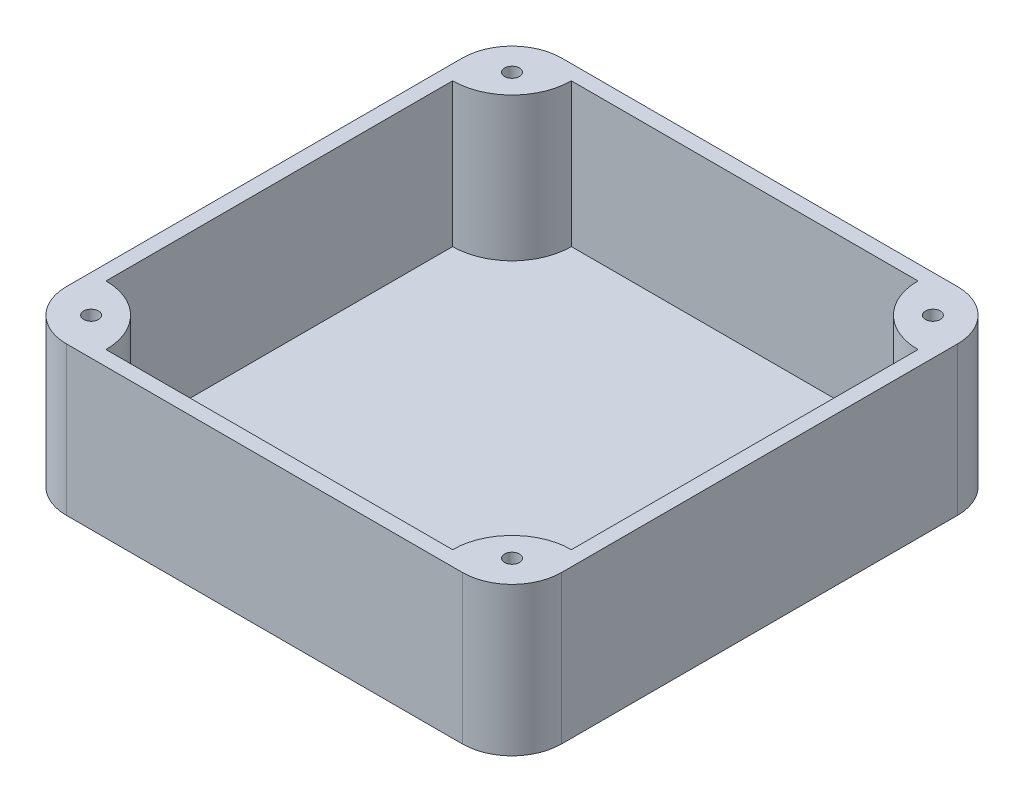
ISO-10303-21;
HEADER;
FILE_DESCRIPTION(('STEP AP214'),'2;1');
FILE_NAME('part.step','',(''),(''),'','','');
FILE_SCHEMA(('AUTOMOTIVE_DESIGN { 1 0 10303 214 1 1 1 1 }'));
ENDSEC;
DATA;
#1=APPLICATION_CONTEXT('core data for automotive mechanical design processes');
#2=APPLICATION_PROTOCOL_DEFINITION('international standard','automotive_design',2000,#1);
#3=PRODUCT_CONTEXT('',#1,'mechanical');
#4=PRODUCT('Part','Part','',(#3));
#5=PRODUCT_RELATED_PRODUCT_CATEGORY('part','',(#4));
#6=PRODUCT_DEFINITION_FORMATION('','',#4);
#7=PRODUCT_DEFINITION_CONTEXT('part definition',#1,'design');
#8=PRODUCT_DEFINITION('design','',#6,#7);
#9=PRODUCT_DEFINITION_SHAPE('','',#8);
#10=(LENGTH_UNIT() NAMED_UNIT(*) SI_UNIT(.MILLI.,.METRE.));
#11=(NAMED_UNIT(*) PLANE_ANGLE_UNIT() SI_UNIT($,.RADIAN.));
#12=(NAMED_UNIT(*) SI_UNIT($,.STERADIAN.) SOLID_ANGLE_UNIT());
#13=UNCERTAINTY_MEASURE_WITH_UNIT(LENGTH_MEASURE(1.E-05),#10,'distance_accuracy_value','');
#14=(GEOMETRIC_REPRESENTATION_CONTEXT(3) GLOBAL_UNCERTAINTY_ASSIGNED_CONTEXT((#13)) GLOBAL_UNIT_ASSIGNED_CONTEXT((#10,
#11,#12)) REPRESENTATION_CONTEXT('',''));
#15=CARTESIAN_POINT('',(0.,0.,0.));
#16=DIRECTION('',(0.,0.,1.));
#17=DIRECTION('',(1.,0.,0.));
#18=AXIS2_PLACEMENT_3D('',#15,#16,#17);
#19=CARTESIAN_POINT('',(0.,30.,-50.));
#20=DIRECTION('',(0.,0.,-1.));
#21=DIRECTION('',(-1.,0.,0.));
#22=AXIS2_PLACEMENT_3D('',#19,#20,#21);
#23=PLANE('',#22);
#24=DIRECTION('',(1.,0.,0.));
#25=VECTOR('',#24,1.);
#26=CARTESIAN_POINT('',(0.,30.,-50.));
#27=LINE('',#26,#25);
#28=CARTESIAN_POINT('',(-40.,30.,-50.));
#29=VERTEX_POINT('',#28);
#30=CARTESIAN_POINT('',(40.,30.,-50.));
#31=VERTEX_POINT('',#30);
#32=EDGE_CURVE('E288',#29,#31,#27,.T.);
#33=ORIENTED_EDGE('',*,*,#32,.T.);
#34=DIRECTION('',(0.,-1.,0.));
#35=VECTOR('',#34,1.);
#36=CARTESIAN_POINT('',(40.,0.,-50.));
#37=LINE('',#36,#35);
#38=CARTESIAN_POINT('',(40.,0.,-50.));
#39=VERTEX_POINT('',#38);
#40=EDGE_CURVE('E211',#31,#39,#37,.T.);
#41=ORIENTED_EDGE('',*,*,#40,.T.);
#42=DIRECTION('',(1.,0.,0.));
#43=VECTOR('',#42,1.);
#44=CARTESIAN_POINT('',(0.,0.,-50.));
#45=LINE('',#44,#43);
#46=CARTESIAN_POINT('',(-40.,0.,-50.));
#47=VERTEX_POINT('',#46);
#48=EDGE_CURVE('E249',#47,#39,#45,.T.);
#49=ORIENTED_EDGE('',*,*,#48,.F.);
#50=DIRECTION('',(0.,-1.,0.));
#51=VECTOR('',#50,1.);
#52=CARTESIAN_POINT('',(-40.,30.,-50.));
#53=LINE('',#52,#51);
#54=EDGE_CURVE('E209',#47,#29,#53,.F.);
#55=ORIENTED_EDGE('',*,*,#54,.T.);
#56=EDGE_LOOP('',(#33,#41,#49,#55));
#57=FACE_BOUND('',#56,.T.);
#58=ADVANCED_FACE('F39',(#57),#23,.T.);
#59=CARTESIAN_POINT('',(-50.,30.,0.));
#60=DIRECTION('',(1.,0.,0.));
#61=DIRECTION('',(0.,0.,-1.));
#62=AXIS2_PLACEMENT_3D('',#59,#60,#61);
#63=PLANE('',#62);
#64=DIRECTION('',(0.,0.,1.));
#65=VECTOR('',#64,1.);
#66=CARTESIAN_POINT('',(-50.,30.,0.));
#67=LINE('',#66,#65);
#68=CARTESIAN_POINT('',(-50.,30.,-40.));
#69=VERTEX_POINT('',#68);
#70=CARTESIAN_POINT('',(-50.,30.,40.));
#71=VERTEX_POINT('',#70);
#72=EDGE_CURVE('E286',#69,#71,#67,.T.);
#73=ORIENTED_EDGE('',*,*,#72,.F.);
#74=DIRECTION('',(0.,-1.,0.));
#75=VECTOR('',#74,1.);
#76=CARTESIAN_POINT('',(-50.,0.,-40.));
#77=LINE('',#76,#75);
#78=CARTESIAN_POINT('',(-50.,0.,-40.));
#79=VERTEX_POINT('',#78);
#80=EDGE_CURVE('E215',#69,#79,#77,.T.);
#81=ORIENTED_EDGE('',*,*,#80,.T.);
#82=DIRECTION('',(0.,0.,1.));
#83=VECTOR('',#82,1.);
#84=CARTESIAN_POINT('',(-50.,0.,0.));
#85=LINE('',#84,#83);
#86=CARTESIAN_POINT('',(-50.,0.,40.));
#87=VERTEX_POINT('',#86);
#88=EDGE_CURVE('E271',#79,#87,#85,.T.);
#89=ORIENTED_EDGE('',*,*,#88,.T.);
#90=DIRECTION('',(0.,-1.,0.));
#91=VECTOR('',#90,1.);
#92=CARTESIAN_POINT('',(-50.,30.,40.));
#93=LINE('',#92,#91);
#94=EDGE_CURVE('E54',#87,#71,#93,.F.);
#95=ORIENTED_EDGE('',*,*,#94,.T.);
#96=EDGE_LOOP('',(#73,#81,#89,#95));
#97=FACE_BOUND('',#96,.T.);
#98=ADVANCED_FACE('F331',(#97),#63,.F.);
#99=CARTESIAN_POINT('',(0.,30.,50.));
#100=DIRECTION('',(0.,0.,-1.));
#101=DIRECTION('',(-1.,0.,0.));
#102=AXIS2_PLACEMENT_3D('',#99,#100,#101);
#103=PLANE('',#102);
#104=DIRECTION('',(1.,0.,0.));
#105=VECTOR('',#104,1.);
#106=CARTESIAN_POINT('',(0.,0.,50.));
#107=LINE('',#106,#105);
#108=CARTESIAN_POINT('',(-40.,0.,50.));
#109=VERTEX_POINT('',#108);
#110=CARTESIAN_POINT('',(40.,0.,50.));
#111=VERTEX_POINT('',#110);
#112=EDGE_CURVE('E268',#109,#111,#107,.T.);
#113=ORIENTED_EDGE('',*,*,#112,.T.);
#114=DIRECTION('',(0.,-1.,0.));
#115=VECTOR('',#114,1.);
#116=CARTESIAN_POINT('',(40.,30.,50.));
#117=LINE('',#116,#115);
#118=CARTESIAN_POINT('',(40.,30.,50.));
#119=VERTEX_POINT('',#118);
#120=EDGE_CURVE('E200',#111,#119,#117,.F.);
#121=ORIENTED_EDGE('',*,*,#120,.T.);
#122=DIRECTION('',(1.,0.,0.));
#123=VECTOR('',#122,1.);
#124=CARTESIAN_POINT('',(0.,30.,50.));
#125=LINE('',#124,#123);
#126=CARTESIAN_POINT('',(-40.,30.,50.));
#127=VERTEX_POINT('',#126);
#128=EDGE_CURVE('E283',#127,#119,#125,.T.);
#129=ORIENTED_EDGE('',*,*,#128,.F.);
#130=DIRECTION('',(0.,-1.,0.));
#131=VECTOR('',#130,1.);
#132=CARTESIAN_POINT('',(-40.,30.,50.));
#133=LINE('',#132,#131);
#134=EDGE_CURVE('E197',#127,#109,#133,.T.);
#135=ORIENTED_EDGE('',*,*,#134,.T.);
#136=EDGE_LOOP('',(#113,#121,#129,#135));
#137=FACE_BOUND('',#136,.T.);
#138=ADVANCED_FACE('F337',(#137),#103,.F.);
#139=CARTESIAN_POINT('',(-47.,30.,0.));
#140=DIRECTION('',(-1.,0.,0.));
#141=DIRECTION('',(0.,0.,1.));
#142=AXIS2_PLACEMENT_3D('',#139,#140,#141);
#143=PLANE('',#142);
#144=DIRECTION('',(0.,-1.,0.));
#145=VECTOR('',#144,1.);
#146=CARTESIAN_POINT('',(-47.,30.,35.));
#147=LINE('',#146,#145);
#148=CARTESIAN_POINT('',(-47.,30.,35.));
#149=VERTEX_POINT('',#148);
#150=CARTESIAN_POINT('',(-47.,1.,35.));
#151=VERTEX_POINT('',#150);
#152=EDGE_CURVE('E158',#149,#151,#147,.T.);
#153=ORIENTED_EDGE('',*,*,#152,.T.);
#154=DIRECTION('',(0.,0.,-1.));
#155=VECTOR('',#154,1.);
#156=CARTESIAN_POINT('',(-47.,1.,0.));
#157=LINE('',#156,#155);
#158=CARTESIAN_POINT('',(-47.,1.,-35.));
#159=VERTEX_POINT('',#158);
#160=EDGE_CURVE('E166',#151,#159,#157,.T.);
#161=ORIENTED_EDGE('',*,*,#160,.T.);
#162=DIRECTION('',(0.,-1.,0.));
#163=VECTOR('',#162,1.);
#164=CARTESIAN_POINT('',(-47.,30.,-35.));
#165=LINE('',#164,#163);
#166=CARTESIAN_POINT('',(-47.,30.,-35.));
#167=VERTEX_POINT('',#166);
#168=EDGE_CURVE('E179',#167,#159,#165,.T.);
#169=ORIENTED_EDGE('',*,*,#168,.F.);
#170=DIRECTION('',(0.,0.,-1.));
#171=VECTOR('',#170,1.);
#172=CARTESIAN_POINT('',(-47.,30.,0.));
#173=LINE('',#172,#171);
#174=EDGE_CURVE('E177',#149,#167,#173,.T.);
#175=ORIENTED_EDGE('',*,*,#174,.F.);
#176=EDGE_LOOP('',(#153,#161,#169,#175));
#177=FACE_BOUND('',#176,.T.);
#178=ADVANCED_FACE('F176',(#177),#143,.F.);
#179=CARTESIAN_POINT('',(0.,30.,-47.));
#180=DIRECTION('',(0.,0.,-1.));
#181=DIRECTION('',(-1.,0.,0.));
#182=AXIS2_PLACEMENT_3D('',#179,#180,#181);
#183=PLANE('',#182);
#184=DIRECTION('',(0.,-1.,0.));
#185=VECTOR('',#184,1.);
#186=CARTESIAN_POINT('',(-35.,30.,-47.));
#187=LINE('',#186,#185);
#188=CARTESIAN_POINT('',(-35.,30.,-47.));
#189=VERTEX_POINT('',#188);
#190=CARTESIAN_POINT('',(-35.,1.,-47.));
#191=VERTEX_POINT('',#190);
#192=EDGE_CURVE('E183',#189,#191,#187,.T.);
#193=ORIENTED_EDGE('',*,*,#192,.T.);
#194=DIRECTION('',(1.,0.,0.));
#195=VECTOR('',#194,1.);
#196=CARTESIAN_POINT('',(0.,1.,-47.));
#197=LINE('',#196,#195);
#198=CARTESIAN_POINT('',(35.,1.,-47.));
#199=VERTEX_POINT('',#198);
#200=EDGE_CURVE('E234',#191,#199,#197,.T.);
#201=ORIENTED_EDGE('',*,*,#200,.T.);
#202=DIRECTION('',(0.,-1.,0.));
#203=VECTOR('',#202,1.);
#204=CARTESIAN_POINT('',(35.,30.,-47.));
#205=LINE('',#204,#203);
#206=CARTESIAN_POINT('',(35.,30.,-47.));
#207=VERTEX_POINT('',#206);
#208=EDGE_CURVE('E246',#207,#199,#205,.T.);
#209=ORIENTED_EDGE('',*,*,#208,.F.);
#210=DIRECTION('',(1.,0.,0.));
#211=VECTOR('',#210,1.);
#212=CARTESIAN_POINT('',(0.,30.,-47.));
#213=LINE('',#212,#211);
#214=EDGE_CURVE('E297',#189,#207,#213,.T.);
#215=ORIENTED_EDGE('',*,*,#214,.F.);
#216=EDGE_LOOP('',(#193,#201,#209,#215));
#217=FACE_BOUND('',#216,.T.);
#218=ADVANCED_FACE('F244',(#217),#183,.F.);
#219=CARTESIAN_POINT('',(47.,30.,0.));
#220=DIRECTION('',(-1.,0.,0.));
#221=DIRECTION('',(0.,0.,1.));
#222=AXIS2_PLACEMENT_3D('',#219,#220,#221);
#223=PLANE('',#222);
#224=DIRECTION('',(0.,0.,-1.));
#225=VECTOR('',#224,1.);
#226=CARTESIAN_POINT('',(47.,1.,0.));
#227=LINE('',#226,#225);
#228=CARTESIAN_POINT('',(47.,1.,35.));
#229=VERTEX_POINT('',#228);
#230=CARTESIAN_POINT('',(47.,1.,-35.));
#231=VERTEX_POINT('',#230);
#232=EDGE_CURVE('E237',#229,#231,#227,.T.);
#233=ORIENTED_EDGE('',*,*,#232,.F.);
#234=DIRECTION('',(0.,-1.,0.));
#235=VECTOR('',#234,1.);
#236=CARTESIAN_POINT('',(47.,30.,35.));
#237=LINE('',#236,#235);
#238=CARTESIAN_POINT('',(47.,30.,35.));
#239=VERTEX_POINT('',#238);
#240=EDGE_CURVE('E254',#239,#229,#237,.T.);
#241=ORIENTED_EDGE('',*,*,#240,.F.);
#242=DIRECTION('',(0.,0.,-1.));
#243=VECTOR('',#242,1.);
#244=CARTESIAN_POINT('',(47.,30.,0.));
#245=LINE('',#244,#243);
#246=CARTESIAN_POINT('',(47.,30.,-35.));
#247=VERTEX_POINT('',#246);
#248=EDGE_CURVE('E294',#239,#247,#245,.T.);
#249=ORIENTED_EDGE('',*,*,#248,.T.);
#250=DIRECTION('',(0.,-1.,0.));
#251=VECTOR('',#250,1.);
#252=CARTESIAN_POINT('',(47.,30.,-35.));
#253=LINE('',#252,#251);
#254=EDGE_CURVE('E252',#247,#231,#253,.T.);
#255=ORIENTED_EDGE('',*,*,#254,.T.);
#256=EDGE_LOOP('',(#233,#241,#249,#255));
#257=FACE_BOUND('',#256,.T.);
#258=ADVANCED_FACE('F345',(#257),#223,.T.);
#259=CARTESIAN_POINT('',(0.,30.,47.));
#260=DIRECTION('',(0.,0.,-1.));
#261=DIRECTION('',(-1.,0.,0.));
#262=AXIS2_PLACEMENT_3D('',#259,#260,#261);
#263=PLANE('',#262);
#264=DIRECTION('',(1.,0.,0.));
#265=VECTOR('',#264,1.);
#266=CARTESIAN_POINT('',(0.,1.,47.));
#267=LINE('',#266,#265);
#268=CARTESIAN_POINT('',(-35.,1.,47.));
#269=VERTEX_POINT('',#268);
#270=CARTESIAN_POINT('',(35.,1.,47.));
#271=VERTEX_POINT('',#270);
#272=EDGE_CURVE('E172',#269,#271,#267,.T.);
#273=ORIENTED_EDGE('',*,*,#272,.F.);
#274=DIRECTION('',(0.,-1.,0.));
#275=VECTOR('',#274,1.);
#276=CARTESIAN_POINT('',(-35.,30.,47.));
#277=LINE('',#276,#275);
#278=CARTESIAN_POINT('',(-35.,30.,47.));
#279=VERTEX_POINT('',#278);
#280=EDGE_CURVE('E159',#279,#269,#277,.T.);
#281=ORIENTED_EDGE('',*,*,#280,.F.);
#282=DIRECTION('',(1.,0.,0.));
#283=VECTOR('',#282,1.);
#284=CARTESIAN_POINT('',(0.,30.,47.));
#285=LINE('',#284,#283);
#286=CARTESIAN_POINT('',(35.,30.,47.));
#287=VERTEX_POINT('',#286);
#288=EDGE_CURVE('E291',#279,#287,#285,.T.);
#289=ORIENTED_EDGE('',*,*,#288,.T.);
#290=DIRECTION('',(0.,-1.,0.));
#291=VECTOR('',#290,1.);
#292=CARTESIAN_POINT('',(35.,30.,47.));
#293=LINE('',#292,#291);
#294=EDGE_CURVE('E259',#287,#271,#293,.T.);
#295=ORIENTED_EDGE('',*,*,#294,.T.);
#296=EDGE_LOOP('',(#273,#281,#289,#295));
#297=FACE_BOUND('',#296,.T.);
#298=ADVANCED_FACE('F341',(#297),#263,.T.);
#299=CARTESIAN_POINT('',(42.5,30.,42.5));
#300=DIRECTION('',(0.,-1.,0.));
#301=DIRECTION('',(0.,0.,-1.));
#302=AXIS2_PLACEMENT_3D('',#299,#300,#301);
#303=CYLINDRICAL_SURFACE('',#302,1.5);
#304=CARTESIAN_POINT('',(42.5,1.,42.5));
#305=DIRECTION('',(0.,1.,0.));
#306=DIRECTION('',(0.,0.,1.));
#307=AXIS2_PLACEMENT_3D('',#304,#305,#306);
#308=CIRCLE('',#307,1.5);
#309=CARTESIAN_POINT('',(42.5,1.,44.));
#310=VERTEX_POINT('',#309);
#311=EDGE_CURVE('E221',#310,#310,#308,.T.);
#312=ORIENTED_EDGE('',*,*,#311,.F.);
#313=EDGE_LOOP('',(#312));
#314=FACE_BOUND('',#313,.T.);
#315=CARTESIAN_POINT('',(42.5,30.,42.5));
#316=DIRECTION('',(0.,1.,0.));
#317=DIRECTION('',(0.,0.,1.));
#318=AXIS2_PLACEMENT_3D('',#315,#316,#317);
#319=CIRCLE('',#318,1.5);
#320=CARTESIAN_POINT('',(42.5,30.,44.));
#321=VERTEX_POINT('',#320);
#322=EDGE_CURVE('E277',#321,#321,#319,.T.);
#323=ORIENTED_EDGE('',*,*,#322,.T.);
#324=EDGE_LOOP('',(#323));
#325=FACE_BOUND('',#324,.T.);
#326=ADVANCED_FACE('F344',(#314,#325),#303,.F.);
#327=CARTESIAN_POINT('',(50.,30.,0.));
#328=DIRECTION('',(-1.,0.,0.));
#329=DIRECTION('',(0.,0.,1.));
#330=AXIS2_PLACEMENT_3D('',#327,#328,#329);
#331=PLANE('',#330);
#332=DIRECTION('',(0.,0.,-1.));
#333=VECTOR('',#332,1.);
#334=CARTESIAN_POINT('',(50.,30.,0.));
#335=LINE('',#334,#333);
#336=CARTESIAN_POINT('',(50.,30.,40.));
#337=VERTEX_POINT('',#336);
#338=CARTESIAN_POINT('',(50.,30.,-40.));
#339=VERTEX_POINT('',#338);
#340=EDGE_CURVE('E280',#337,#339,#335,.T.);
#341=ORIENTED_EDGE('',*,*,#340,.F.);
#342=DIRECTION('',(0.,-1.,0.));
#343=VECTOR('',#342,1.);
#344=CARTESIAN_POINT('',(50.,30.,40.));
#345=LINE('',#344,#343);
#346=CARTESIAN_POINT('',(50.,0.,40.));
#347=VERTEX_POINT('',#346);
#348=EDGE_CURVE('E181',#337,#347,#345,.T.);
#349=ORIENTED_EDGE('',*,*,#348,.T.);
#350=DIRECTION('',(0.,0.,-1.));
#351=VECTOR('',#350,1.);
#352=CARTESIAN_POINT('',(50.,0.,0.));
#353=LINE('',#352,#351);
#354=CARTESIAN_POINT('',(50.,0.,-40.));
#355=VERTEX_POINT('',#354);
#356=EDGE_CURVE('E264',#347,#355,#353,.T.);
#357=ORIENTED_EDGE('',*,*,#356,.T.);
#358=DIRECTION('',(0.,-1.,0.));
#359=VECTOR('',#358,1.);
#360=CARTESIAN_POINT('',(50.,30.,-40.));
#361=LINE('',#360,#359);
#362=EDGE_CURVE('E178',#355,#339,#361,.F.);
#363=ORIENTED_EDGE('',*,*,#362,.T.);
#364=EDGE_LOOP('',(#341,#349,#357,#363));
#365=FACE_BOUND('',#364,.T.);
#366=ADVANCED_FACE('F357',(#365),#331,.F.);
#367=CARTESIAN_POINT('',(-42.5,30.,-42.5));
#368=DIRECTION('',(0.,-1.,0.));
#369=DIRECTION('',(0.,0.,-1.));
#370=AXIS2_PLACEMENT_3D('',#367,#368,#369);
#371=CYLINDRICAL_SURFACE('',#370,1.5);
#372=CARTESIAN_POINT('',(-42.5,1.,-42.5));
#373=DIRECTION('',(0.,1.,0.));
#374=DIRECTION('',(0.,0.,1.));
#375=AXIS2_PLACEMENT_3D('',#372,#373,#374);
#376=CIRCLE('',#375,1.5);
#377=CARTESIAN_POINT('',(-42.5,1.,-41.));
#378=VERTEX_POINT('',#377);
#379=EDGE_CURVE('E218',#378,#378,#376,.T.);
#380=ORIENTED_EDGE('',*,*,#379,.F.);
#381=EDGE_LOOP('',(#380));
#382=FACE_BOUND('',#381,.T.);
#383=CARTESIAN_POINT('',(-42.5,30.,-42.5));
#384=DIRECTION('',(0.,1.,0.));
#385=DIRECTION('',(0.,0.,1.));
#386=AXIS2_PLACEMENT_3D('',#383,#384,#385);
#387=CIRCLE('',#386,1.5);
#388=CARTESIAN_POINT('',(-42.5,30.,-41.));
#389=VERTEX_POINT('',#388);
#390=EDGE_CURVE('E300',#389,#389,#387,.T.);
#391=ORIENTED_EDGE('',*,*,#390,.T.);
#392=EDGE_LOOP('',(#391));
#393=FACE_BOUND('',#392,.T.);
#394=ADVANCED_FACE('F354',(#382,#393),#371,.F.);
#395=CARTESIAN_POINT('',(42.5,30.,-42.5));
#396=DIRECTION('',(0.,-1.,0.));
#397=DIRECTION('',(0.,0.,-1.));
#398=AXIS2_PLACEMENT_3D('',#395,#396,#397);
#399=CYLINDRICAL_SURFACE('',#398,1.5);
#400=CARTESIAN_POINT('',(42.5,1.,-42.5));
#401=DIRECTION('',(0.,1.,0.));
#402=DIRECTION('',(0.,0.,1.));
#403=AXIS2_PLACEMENT_3D('',#400,#401,#402);
#404=CIRCLE('',#403,1.5);
#405=CARTESIAN_POINT('',(42.5,1.,-41.));
#406=VERTEX_POINT('',#405);
#407=EDGE_CURVE('E309',#406,#406,#404,.F.);
#408=ORIENTED_EDGE('',*,*,#407,.T.);
#409=EDGE_LOOP('',(#408));
#410=FACE_BOUND('',#409,.T.);
#411=CARTESIAN_POINT('',(42.5,30.,-42.5));
#412=DIRECTION('',(0.,1.,0.));
#413=DIRECTION('',(0.,0.,1.));
#414=AXIS2_PLACEMENT_3D('',#411,#412,#413);
#415=CIRCLE('',#414,1.5);
#416=CARTESIAN_POINT('',(42.5,30.,-41.));
#417=VERTEX_POINT('',#416);
#418=EDGE_CURVE('E267',#417,#417,#415,.F.);
#419=ORIENTED_EDGE('',*,*,#418,.F.);
#420=EDGE_LOOP('',(#419));
#421=FACE_BOUND('',#420,.T.);
#422=ADVANCED_FACE('F313',(#410,#421),#399,.F.);
#423=CARTESIAN_POINT('',(-42.5,30.,42.5));
#424=DIRECTION('',(0.,-1.,0.));
#425=DIRECTION('',(0.,0.,-1.));
#426=AXIS2_PLACEMENT_3D('',#423,#424,#425);
#427=CYLINDRICAL_SURFACE('',#426,1.5);
#428=CARTESIAN_POINT('',(-42.5,1.,42.5));
#429=DIRECTION('',(0.,1.,0.));
#430=DIRECTION('',(0.,0.,1.));
#431=AXIS2_PLACEMENT_3D('',#428,#429,#430);
#432=CIRCLE('',#431,1.5);
#433=CARTESIAN_POINT('',(-42.5,1.,44.));
#434=VERTEX_POINT('',#433);
#435=EDGE_CURVE('E173',#434,#434,#432,.F.);
#436=ORIENTED_EDGE('',*,*,#435,.T.);
#437=EDGE_LOOP('',(#436));
#438=FACE_BOUND('',#437,.T.);
#439=CARTESIAN_POINT('',(-42.5,30.,42.5));
#440=DIRECTION('',(0.,1.,0.));
#441=DIRECTION('',(0.,0.,1.));
#442=AXIS2_PLACEMENT_3D('',#439,#440,#441);
#443=CIRCLE('',#442,1.5);
#444=CARTESIAN_POINT('',(-42.5,30.,44.));
#445=VERTEX_POINT('',#444);
#446=EDGE_CURVE('E263',#445,#445,#443,.F.);
#447=ORIENTED_EDGE('',*,*,#446,.F.);
#448=EDGE_LOOP('',(#447));
#449=FACE_BOUND('',#448,.T.);
#450=ADVANCED_FACE('F361',(#438,#449),#427,.F.);
#451=CARTESIAN_POINT('',(0.,30.,0.));
#452=DIRECTION('',(0.,1.,0.));
#453=DIRECTION('',(0.,0.,1.));
#454=AXIS2_PLACEMENT_3D('',#451,#452,#453);
#455=PLANE('',#454);
#456=ORIENTED_EDGE('',*,*,#418,.T.);
#457=EDGE_LOOP('',(#456));
#458=FACE_BOUND('',#457,.T.);
#459=ORIENTED_EDGE('',*,*,#390,.F.);
#460=EDGE_LOOP('',(#459));
#461=FACE_BOUND('',#460,.T.);
#462=ORIENTED_EDGE('',*,*,#248,.F.);
#463=CARTESIAN_POINT('',(47.,30.,47.));
#464=DIRECTION('',(0.,1.,0.));
#465=DIRECTION('',(0.,0.,1.));
#466=AXIS2_PLACEMENT_3D('',#463,#464,#465);
#467=CIRCLE('',#466,12.);
#468=EDGE_CURVE('E230',#239,#287,#467,.T.);
#469=ORIENTED_EDGE('',*,*,#468,.T.);
#470=ORIENTED_EDGE('',*,*,#288,.F.);
#471=CARTESIAN_POINT('',(-47.,30.,47.));
#472=DIRECTION('',(0.,1.,0.));
#473=DIRECTION('',(0.,0.,1.));
#474=AXIS2_PLACEMENT_3D('',#471,#472,#473);
#475=CIRCLE('',#474,12.);
#476=EDGE_CURVE('E228',#279,#149,#475,.T.);
#477=ORIENTED_EDGE('',*,*,#476,.T.);
#478=ORIENTED_EDGE('',*,*,#174,.T.);
#479=CARTESIAN_POINT('',(-47.,30.,-47.));
#480=DIRECTION('',(0.,1.,0.));
#481=DIRECTION('',(0.,0.,1.));
#482=AXIS2_PLACEMENT_3D('',#479,#480,#481);
#483=CIRCLE('',#482,12.);
#484=EDGE_CURVE('E224',#167,#189,#483,.T.);
#485=ORIENTED_EDGE('',*,*,#484,.T.);
#486=ORIENTED_EDGE('',*,*,#214,.T.);
#487=CARTESIAN_POINT('',(47.,30.,-47.));
#488=DIRECTION('',(0.,1.,0.));
#489=DIRECTION('',(0.,0.,1.));
#490=AXIS2_PLACEMENT_3D('',#487,#488,#489);
#491=CIRCLE('',#490,12.);
#492=EDGE_CURVE('E226',#207,#247,#491,.T.);
#493=ORIENTED_EDGE('',*,*,#492,.T.);
#494=EDGE_LOOP('',(#462,#469,#470,#477,#478,#485,#486,#493));
#495=FACE_BOUND('',#494,.T.);
#496=ORIENTED_EDGE('',*,*,#128,.T.);
#497=CARTESIAN_POINT('',(40.,30.,40.));
#498=DIRECTION('',(0.,1.,0.));
#499=DIRECTION('',(0.,0.,1.));
#500=AXIS2_PLACEMENT_3D('',#497,#498,#499);
#501=CIRCLE('',#500,10.);
#502=EDGE_CURVE('E207',#119,#337,#501,.T.);
#503=ORIENTED_EDGE('',*,*,#502,.T.);
#504=ORIENTED_EDGE('',*,*,#340,.T.);
#505=CARTESIAN_POINT('',(40.,30.,-40.));
#506=DIRECTION('',(0.,1.,0.));
#507=DIRECTION('',(0.,0.,1.));
#508=AXIS2_PLACEMENT_3D('',#505,#506,#507);
#509=CIRCLE('',#508,10.);
#510=EDGE_CURVE('E205',#339,#31,#509,.T.);
#511=ORIENTED_EDGE('',*,*,#510,.T.);
#512=ORIENTED_EDGE('',*,*,#32,.F.);
#513=CARTESIAN_POINT('',(-40.,30.,-40.));
#514=DIRECTION('',(0.,1.,0.));
#515=DIRECTION('',(0.,0.,1.));
#516=AXIS2_PLACEMENT_3D('',#513,#514,#515);
#517=CIRCLE('',#516,10.);
#518=EDGE_CURVE('E61',#29,#69,#517,.T.);
#519=ORIENTED_EDGE('',*,*,#518,.T.);
#520=ORIENTED_EDGE('',*,*,#72,.T.);
#521=CARTESIAN_POINT('',(-40.,30.,40.));
#522=DIRECTION('',(0.,1.,0.));
#523=DIRECTION('',(0.,0.,1.));
#524=AXIS2_PLACEMENT_3D('',#521,#522,#523);
#525=CIRCLE('',#524,10.);
#526=EDGE_CURVE('E202',#71,#127,#525,.T.);
#527=ORIENTED_EDGE('',*,*,#526,.T.);
#528=EDGE_LOOP('',(#496,#503,#504,#511,#512,#519,#520,#527));
#529=FACE_BOUND('',#528,.T.);
#530=ORIENTED_EDGE('',*,*,#322,.F.);
#531=EDGE_LOOP('',(#530));
#532=FACE_BOUND('',#531,.T.);
#533=ORIENTED_EDGE('',*,*,#446,.T.);
#534=EDGE_LOOP('',(#533));
#535=FACE_BOUND('',#534,.T.);
#536=ADVANCED_FACE('F390',(#458,#461,#495,#529,#532,#535),#455,.T.);
#537=CARTESIAN_POINT('',(0.,0.,0.));
#538=DIRECTION('',(0.,1.,0.));
#539=DIRECTION('',(0.,0.,1.));
#540=AXIS2_PLACEMENT_3D('',#537,#538,#539);
#541=PLANE('',#540);
#542=ORIENTED_EDGE('',*,*,#356,.F.);
#543=CARTESIAN_POINT('',(40.,0.,40.));
#544=DIRECTION('',(0.,1.,0.));
#545=DIRECTION('',(0.,0.,1.));
#546=AXIS2_PLACEMENT_3D('',#543,#544,#545);
#547=CIRCLE('',#546,10.);
#548=EDGE_CURVE('E195',#347,#111,#547,.F.);
#549=ORIENTED_EDGE('',*,*,#548,.T.);
#550=ORIENTED_EDGE('',*,*,#112,.F.);
#551=CARTESIAN_POINT('',(-40.,0.,40.));
#552=DIRECTION('',(0.,1.,0.));
#553=DIRECTION('',(0.,0.,1.));
#554=AXIS2_PLACEMENT_3D('',#551,#552,#553);
#555=CIRCLE('',#554,10.);
#556=EDGE_CURVE('E189',#109,#87,#555,.F.);
#557=ORIENTED_EDGE('',*,*,#556,.T.);
#558=ORIENTED_EDGE('',*,*,#88,.F.);
#559=CARTESIAN_POINT('',(-40.,0.,-40.));
#560=DIRECTION('',(0.,1.,0.));
#561=DIRECTION('',(0.,0.,1.));
#562=AXIS2_PLACEMENT_3D('',#559,#560,#561);
#563=CIRCLE('',#562,10.);
#564=EDGE_CURVE('E191',#79,#47,#563,.F.);
#565=ORIENTED_EDGE('',*,*,#564,.T.);
#566=ORIENTED_EDGE('',*,*,#48,.T.);
#567=CARTESIAN_POINT('',(40.,0.,-40.));
#568=DIRECTION('',(0.,1.,0.));
#569=DIRECTION('',(0.,0.,1.));
#570=AXIS2_PLACEMENT_3D('',#567,#568,#569);
#571=CIRCLE('',#570,10.);
#572=EDGE_CURVE('E193',#39,#355,#571,.F.);
#573=ORIENTED_EDGE('',*,*,#572,.T.);
#574=EDGE_LOOP('',(#542,#549,#550,#557,#558,#565,#566,#573));
#575=FACE_BOUND('',#574,.T.);
#576=ADVANCED_FACE('F395',(#575),#541,.F.);
#577=CARTESIAN_POINT('',(0.,1.,0.));
#578=DIRECTION('',(0.,1.,0.));
#579=DIRECTION('',(0.,0.,1.));
#580=AXIS2_PLACEMENT_3D('',#577,#578,#579);
#581=PLANE('',#580);
#582=ORIENTED_EDGE('',*,*,#160,.F.);
#583=CARTESIAN_POINT('',(-47.,1.,47.));
#584=DIRECTION('',(0.,1.,0.));
#585=DIRECTION('',(0.,0.,1.));
#586=AXIS2_PLACEMENT_3D('',#583,#584,#585);
#587=CIRCLE('',#586,12.);
#588=EDGE_CURVE('E153',#151,#269,#587,.F.);
#589=ORIENTED_EDGE('',*,*,#588,.T.);
#590=ORIENTED_EDGE('',*,*,#272,.T.);
#591=CARTESIAN_POINT('',(47.,1.,47.));
#592=DIRECTION('',(0.,1.,0.));
#593=DIRECTION('',(0.,0.,1.));
#594=AXIS2_PLACEMENT_3D('',#591,#592,#593);
#595=CIRCLE('',#594,12.);
#596=EDGE_CURVE('E163',#271,#229,#595,.F.);
#597=ORIENTED_EDGE('',*,*,#596,.T.);
#598=ORIENTED_EDGE('',*,*,#232,.T.);
#599=CARTESIAN_POINT('',(47.,1.,-47.));
#600=DIRECTION('',(0.,1.,0.));
#601=DIRECTION('',(0.,0.,1.));
#602=AXIS2_PLACEMENT_3D('',#599,#600,#601);
#603=CIRCLE('',#602,12.);
#604=EDGE_CURVE('E47',#231,#199,#603,.F.);
#605=ORIENTED_EDGE('',*,*,#604,.T.);
#606=ORIENTED_EDGE('',*,*,#200,.F.);
#607=CARTESIAN_POINT('',(-47.,1.,-47.));
#608=DIRECTION('',(0.,1.,0.));
#609=DIRECTION('',(0.,0.,1.));
#610=AXIS2_PLACEMENT_3D('',#607,#608,#609);
#611=CIRCLE('',#610,12.);
#612=EDGE_CURVE('E11',#191,#159,#611,.F.);
#613=ORIENTED_EDGE('',*,*,#612,.T.);
#614=EDGE_LOOP('',(#582,#589,#590,#597,#598,#605,#606,#613));
#615=FACE_BOUND('',#614,.T.);
#616=ADVANCED_FACE('F167',(#615),#581,.T.);
#617=CARTESIAN_POINT('',(40.,30.,40.));
#618=DIRECTION('',(0.,-1.,0.));
#619=DIRECTION('',(0.,0.,-1.));
#620=AXIS2_PLACEMENT_3D('',#617,#618,#619);
#621=CYLINDRICAL_SURFACE('',#620,10.);
#622=ORIENTED_EDGE('',*,*,#502,.F.);
#623=ORIENTED_EDGE('',*,*,#120,.F.);
#624=ORIENTED_EDGE('',*,*,#548,.F.);
#625=ORIENTED_EDGE('',*,*,#348,.F.);
#626=EDGE_LOOP('',(#622,#623,#624,#625));
#627=FACE_BOUND('',#626,.T.);
#628=ADVANCED_FACE('F362',(#627),#621,.T.);
#629=CARTESIAN_POINT('',(40.,30.,-40.));
#630=DIRECTION('',(0.,1.,0.));
#631=DIRECTION('',(0.,0.,1.));
#632=AXIS2_PLACEMENT_3D('',#629,#630,#631);
#633=CYLINDRICAL_SURFACE('',#632,10.);
#634=ORIENTED_EDGE('',*,*,#510,.F.);
#635=ORIENTED_EDGE('',*,*,#362,.F.);
#636=ORIENTED_EDGE('',*,*,#572,.F.);
#637=ORIENTED_EDGE('',*,*,#40,.F.);
#638=EDGE_LOOP('',(#634,#635,#636,#637));
#639=FACE_BOUND('',#638,.T.);
#640=ADVANCED_FACE('F365',(#639),#633,.T.);
#641=CARTESIAN_POINT('',(-40.,30.,-40.));
#642=DIRECTION('',(0.,1.,0.));
#643=DIRECTION('',(0.,0.,1.));
#644=AXIS2_PLACEMENT_3D('',#641,#642,#643);
#645=CYLINDRICAL_SURFACE('',#644,10.);
#646=ORIENTED_EDGE('',*,*,#518,.F.);
#647=ORIENTED_EDGE('',*,*,#54,.F.);
#648=ORIENTED_EDGE('',*,*,#564,.F.);
#649=ORIENTED_EDGE('',*,*,#80,.F.);
#650=EDGE_LOOP('',(#646,#647,#648,#649));
#651=FACE_BOUND('',#650,.T.);
#652=ADVANCED_FACE('F369',(#651),#645,.T.);
#653=CARTESIAN_POINT('',(-40.,30.,40.));
#654=DIRECTION('',(0.,-1.,0.));
#655=DIRECTION('',(0.,0.,-1.));
#656=AXIS2_PLACEMENT_3D('',#653,#654,#655);
#657=CYLINDRICAL_SURFACE('',#656,10.);
#658=ORIENTED_EDGE('',*,*,#526,.F.);
#659=ORIENTED_EDGE('',*,*,#94,.F.);
#660=ORIENTED_EDGE('',*,*,#556,.F.);
#661=ORIENTED_EDGE('',*,*,#134,.F.);
#662=EDGE_LOOP('',(#658,#659,#660,#661));
#663=FACE_BOUND('',#662,.T.);
#664=ADVANCED_FACE('F373',(#663),#657,.T.);
#665=CARTESIAN_POINT('',(0.,1.,0.));
#666=DIRECTION('',(0.,1.,0.));
#667=DIRECTION('',(0.,0.,1.));
#668=AXIS2_PLACEMENT_3D('',#665,#666,#667);
#669=PLANE('',#668);
#670=ORIENTED_EDGE('',*,*,#379,.T.);
#671=EDGE_LOOP('',(#670));
#672=FACE_BOUND('',#671,.T.);
#673=ADVANCED_FACE('F376',(#672),#669,.T.);
#674=CARTESIAN_POINT('',(0.,1.,0.));
#675=DIRECTION('',(0.,1.,0.));
#676=DIRECTION('',(0.,0.,1.));
#677=AXIS2_PLACEMENT_3D('',#674,#675,#676);
#678=PLANE('',#677);
#679=ORIENTED_EDGE('',*,*,#435,.F.);
#680=EDGE_LOOP('',(#679));
#681=FACE_BOUND('',#680,.T.);
#682=ADVANCED_FACE('F327',(#681),#678,.T.);
#683=CARTESIAN_POINT('',(0.,1.,0.));
#684=DIRECTION('',(0.,1.,0.));
#685=DIRECTION('',(0.,0.,1.));
#686=AXIS2_PLACEMENT_3D('',#683,#684,#685);
#687=PLANE('',#686);
#688=ORIENTED_EDGE('',*,*,#311,.T.);
#689=EDGE_LOOP('',(#688));
#690=FACE_BOUND('',#689,.T.);
#691=ADVANCED_FACE('F319',(#690),#687,.T.);
#692=CARTESIAN_POINT('',(0.,1.,0.));
#693=DIRECTION('',(0.,1.,0.));
#694=DIRECTION('',(0.,0.,1.));
#695=AXIS2_PLACEMENT_3D('',#692,#693,#694);
#696=PLANE('',#695);
#697=ORIENTED_EDGE('',*,*,#407,.F.);
#698=EDGE_LOOP('',(#697));
#699=FACE_BOUND('',#698,.T.);
#700=ADVANCED_FACE('F316',(#699),#696,.T.);
#701=CARTESIAN_POINT('',(47.,30.,47.));
#702=DIRECTION('',(0.,1.,0.));
#703=DIRECTION('',(0.,0.,1.));
#704=AXIS2_PLACEMENT_3D('',#701,#702,#703);
#705=CYLINDRICAL_SURFACE('',#704,12.);
#706=ORIENTED_EDGE('',*,*,#468,.F.);
#707=ORIENTED_EDGE('',*,*,#240,.T.);
#708=ORIENTED_EDGE('',*,*,#596,.F.);
#709=ORIENTED_EDGE('',*,*,#294,.F.);
#710=EDGE_LOOP('',(#706,#707,#708,#709));
#711=FACE_BOUND('',#710,.T.);
#712=ADVANCED_FACE('F318',(#711),#705,.T.);
#713=CARTESIAN_POINT('',(-47.,30.,47.));
#714=DIRECTION('',(0.,1.,0.));
#715=DIRECTION('',(0.,0.,1.));
#716=AXIS2_PLACEMENT_3D('',#713,#714,#715);
#717=CYLINDRICAL_SURFACE('',#716,12.);
#718=ORIENTED_EDGE('',*,*,#476,.F.);
#719=ORIENTED_EDGE('',*,*,#280,.T.);
#720=ORIENTED_EDGE('',*,*,#588,.F.);
#721=ORIENTED_EDGE('',*,*,#152,.F.);
#722=EDGE_LOOP('',(#718,#719,#720,#721));
#723=FACE_BOUND('',#722,.T.);
#724=ADVANCED_FACE('F156',(#723),#717,.T.);
#725=CARTESIAN_POINT('',(47.,30.,-47.));
#726=DIRECTION('',(0.,1.,0.));
#727=DIRECTION('',(0.,0.,1.));
#728=AXIS2_PLACEMENT_3D('',#725,#726,#727);
#729=CYLINDRICAL_SURFACE('',#728,12.);
#730=ORIENTED_EDGE('',*,*,#492,.F.);
#731=ORIENTED_EDGE('',*,*,#208,.T.);
#732=ORIENTED_EDGE('',*,*,#604,.F.);
#733=ORIENTED_EDGE('',*,*,#254,.F.);
#734=EDGE_LOOP('',(#730,#731,#732,#733));
#735=FACE_BOUND('',#734,.T.);
#736=ADVANCED_FACE('F251',(#735),#729,.T.);
#737=CARTESIAN_POINT('',(-47.,30.,-47.));
#738=DIRECTION('',(0.,1.,0.));
#739=DIRECTION('',(0.,0.,1.));
#740=AXIS2_PLACEMENT_3D('',#737,#738,#739);
#741=CYLINDRICAL_SURFACE('',#740,12.);
#742=ORIENTED_EDGE('',*,*,#484,.F.);
#743=ORIENTED_EDGE('',*,*,#168,.T.);
#744=ORIENTED_EDGE('',*,*,#612,.F.);
#745=ORIENTED_EDGE('',*,*,#192,.F.);
#746=EDGE_LOOP('',(#742,#743,#744,#745));
#747=FACE_BOUND('',#746,.T.);
#748=ADVANCED_FACE('F41',(#747),#741,.T.);
#749=CLOSED_SHELL('',(#58,#98,#138,#178,#218,#258,#298,#326,#366,#394,#422,#450,#536,#576,#616,
#628,#640,#652,#664,#673,#682,#691,#700,#712,#724,#736,#748));
#750=MANIFOLD_SOLID_BREP('B2',#749);
#751=ADVANCED_BREP_SHAPE_REPRESENTATION('',(#18,#750),#14);
#752=SHAPE_DEFINITION_REPRESENTATION(#9,#751);
ENDSEC;
END-ISO-10303-21;
